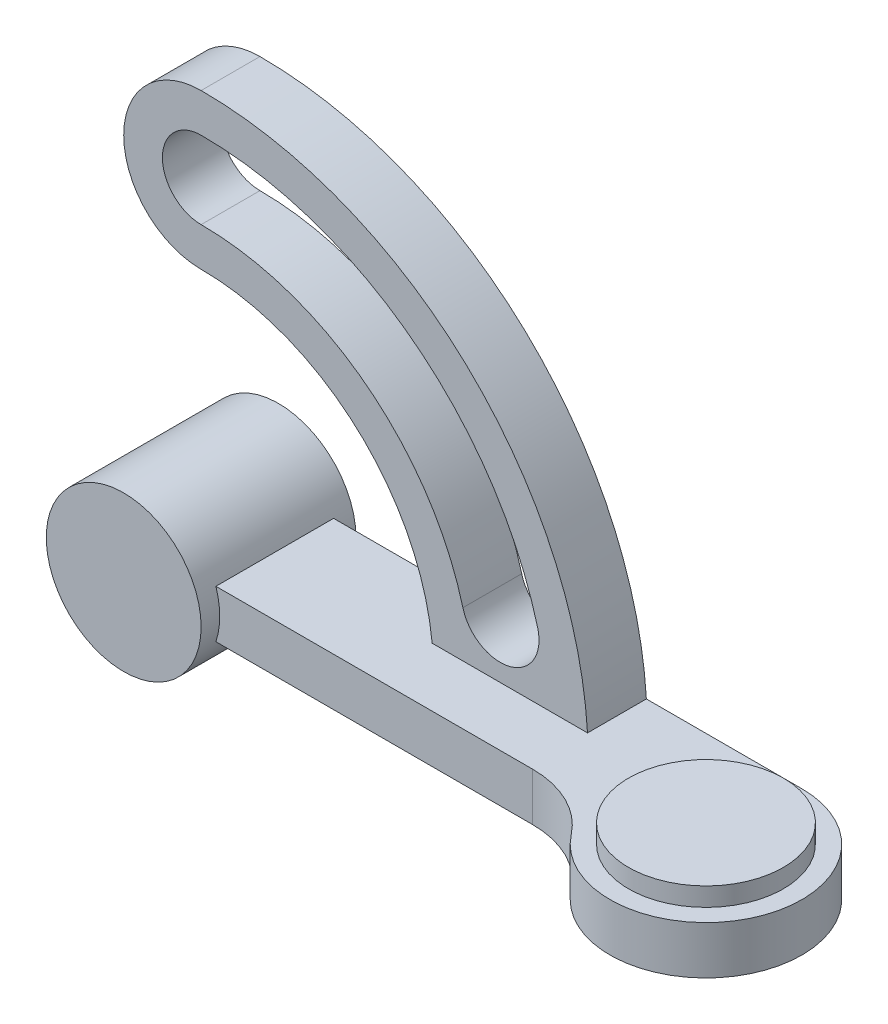
ISO-10303-21;
HEADER;
FILE_DESCRIPTION(('STEP AP214'),'2;1');
FILE_NAME('part.step','',(''),(''),'','','');
FILE_SCHEMA(('AUTOMOTIVE_DESIGN { 1 0 10303 214 1 1 1 1 }'));
ENDSEC;
DATA;
#1=APPLICATION_CONTEXT('core data for automotive mechanical design processes');
#2=APPLICATION_PROTOCOL_DEFINITION('international standard','automotive_design',2000,#1);
#3=PRODUCT_CONTEXT('',#1,'mechanical');
#4=PRODUCT('Part','Part','',(#3));
#5=PRODUCT_RELATED_PRODUCT_CATEGORY('part','',(#4));
#6=PRODUCT_DEFINITION_FORMATION('','',#4);
#7=PRODUCT_DEFINITION_CONTEXT('part definition',#1,'design');
#8=PRODUCT_DEFINITION('design','',#6,#7);
#9=PRODUCT_DEFINITION_SHAPE('','',#8);
#10=(LENGTH_UNIT() NAMED_UNIT(*) SI_UNIT(.MILLI.,.METRE.));
#11=(NAMED_UNIT(*) PLANE_ANGLE_UNIT() SI_UNIT($,.RADIAN.));
#12=(NAMED_UNIT(*) SI_UNIT($,.STERADIAN.) SOLID_ANGLE_UNIT());
#13=UNCERTAINTY_MEASURE_WITH_UNIT(LENGTH_MEASURE(1.E-05),#10,'distance_accuracy_value','');
#14=(GEOMETRIC_REPRESENTATION_CONTEXT(3) GLOBAL_UNCERTAINTY_ASSIGNED_CONTEXT((#13)) GLOBAL_UNIT_ASSIGNED_CONTEXT((#10,
#11,#12)) REPRESENTATION_CONTEXT('',''));
#15=CARTESIAN_POINT('',(0.,0.,0.));
#16=DIRECTION('',(0.,0.,1.));
#17=DIRECTION('',(1.,0.,0.));
#18=AXIS2_PLACEMENT_3D('',#15,#16,#17);
#19=CARTESIAN_POINT('',(-88.9,3.937,-18.796));
#20=DIRECTION('',(0.,0.,1.));
#21=DIRECTION('',(1.,0.,0.));
#22=AXIS2_PLACEMENT_3D('',#19,#20,#21);
#23=CYLINDRICAL_SURFACE('',#22,12.7);
#24=CARTESIAN_POINT('',(-88.9,3.937,3.55600000000001));
#25=DIRECTION('',(0.,0.,-1.));
#26=DIRECTION('',(-1.,0.,0.));
#27=AXIS2_PLACEMENT_3D('',#24,#25,#26);
#28=CIRCLE('',#27,12.7);
#29=CARTESIAN_POINT('',(-76.8256457315515,7.874,3.55600000000001));
#30=VERTEX_POINT('',#29);
#31=CARTESIAN_POINT('',(-76.8256457315515,0.,3.55600000000001));
#32=VERTEX_POINT('',#31);
#33=EDGE_CURVE('E206',#30,#32,#28,.T.);
#34=ORIENTED_EDGE('',*,*,#33,.F.);
#35=DIRECTION('',(0.,0.,1.));
#36=VECTOR('',#35,1.);
#37=CARTESIAN_POINT('',(-76.8256457315515,7.874,-18.796));
#38=LINE('',#37,#36);
#39=CARTESIAN_POINT('',(-76.8256457315515,7.874,-15.748));
#40=VERTEX_POINT('',#39);
#41=EDGE_CURVE('E212',#30,#40,#38,.F.);
#42=ORIENTED_EDGE('',*,*,#41,.T.);
#43=CARTESIAN_POINT('',(-88.9,3.937,-15.748));
#44=DIRECTION('',(0.,0.,1.));
#45=DIRECTION('',(1.,0.,0.));
#46=AXIS2_PLACEMENT_3D('',#43,#44,#45);
#47=CIRCLE('',#46,12.7);
#48=CARTESIAN_POINT('',(-76.8256457315515,0.,-15.748));
#49=VERTEX_POINT('',#48);
#50=EDGE_CURVE('E209',#49,#40,#47,.T.);
#51=ORIENTED_EDGE('',*,*,#50,.F.);
#52=DIRECTION('',(0.,0.,1.));
#53=VECTOR('',#52,1.);
#54=CARTESIAN_POINT('',(-76.8256457315515,0.,-18.796));
#55=LINE('',#54,#53);
#56=EDGE_CURVE('E11',#32,#49,#55,.F.);
#57=ORIENTED_EDGE('',*,*,#56,.F.);
#58=EDGE_LOOP('',(#34,#42,#51,#57));
#59=FACE_BOUND('',#58,.T.);
#60=CARTESIAN_POINT('',(-88.9,3.937,-18.796));
#61=DIRECTION('',(0.,0.,1.));
#62=DIRECTION('',(1.,0.,0.));
#63=AXIS2_PLACEMENT_3D('',#60,#61,#62);
#64=CIRCLE('',#63,12.7);
#65=CARTESIAN_POINT('',(-76.2,3.937,-18.796));
#66=VERTEX_POINT('',#65);
#67=EDGE_CURVE('E203',#66,#66,#64,.T.);
#68=ORIENTED_EDGE('',*,*,#67,.T.);
#69=EDGE_LOOP('',(#68));
#70=FACE_BOUND('',#69,.T.);
#71=CARTESIAN_POINT('',(-88.9,3.937,6.604));
#72=DIRECTION('',(0.,0.,1.));
#73=DIRECTION('',(1.,0.,0.));
#74=AXIS2_PLACEMENT_3D('',#71,#72,#73);
#75=CIRCLE('',#74,12.7);
#76=CARTESIAN_POINT('',(-76.2,3.937,6.604));
#77=VERTEX_POINT('',#76);
#78=EDGE_CURVE('E194',#77,#77,#75,.T.);
#79=ORIENTED_EDGE('',*,*,#78,.F.);
#80=EDGE_LOOP('',(#79));
#81=FACE_BOUND('',#80,.T.);
#82=ADVANCED_FACE('F36',(#59,#70,#81),#23,.T.);
#83=CARTESIAN_POINT('',(-88.9,3.937,-18.796));
#84=DIRECTION('',(0.,0.,1.));
#85=DIRECTION('',(1.,0.,0.));
#86=AXIS2_PLACEMENT_3D('',#83,#84,#85);
#87=PLANE('',#86);
#88=ORIENTED_EDGE('',*,*,#67,.F.);
#89=EDGE_LOOP('',(#88));
#90=FACE_BOUND('',#89,.T.);
#91=ADVANCED_FACE('F287',(#90),#87,.F.);
#92=CARTESIAN_POINT('',(-88.9,3.937,6.604));
#93=DIRECTION('',(0.,0.,1.));
#94=DIRECTION('',(1.,0.,0.));
#95=AXIS2_PLACEMENT_3D('',#92,#93,#94);
#96=PLANE('',#95);
#97=ORIENTED_EDGE('',*,*,#78,.T.);
#98=EDGE_LOOP('',(#97));
#99=FACE_BOUND('',#98,.T.);
#100=ADVANCED_FACE('F292',(#99),#96,.T.);
#101=CARTESIAN_POINT('',(0.,7.874,0.));
#102=DIRECTION('',(0.,-1.,0.));
#103=DIRECTION('',(0.,0.,-1.));
#104=AXIS2_PLACEMENT_3D('',#101,#102,#103);
#105=CYLINDRICAL_SURFACE('',#104,15.748);
#106=CARTESIAN_POINT('',(0.,0.,0.));
#107=DIRECTION('',(0.,1.,0.));
#108=DIRECTION('',(0.,0.,1.));
#109=AXIS2_PLACEMENT_3D('',#106,#107,#108);
#110=CIRCLE('',#109,15.748);
#111=CARTESIAN_POINT('',(-12.4434078933385,0.,9.652));
#112=VERTEX_POINT('',#111);
#113=CARTESIAN_POINT('',(0.,0.,-15.748));
#114=VERTEX_POINT('',#113);
#115=EDGE_CURVE('E215',#112,#114,#110,.T.);
#116=ORIENTED_EDGE('',*,*,#115,.T.);
#117=DIRECTION('',(0.,-1.,0.));
#118=VECTOR('',#117,1.);
#119=CARTESIAN_POINT('',(0.,7.874,-15.748));
#120=LINE('',#119,#118);
#121=CARTESIAN_POINT('',(0.,7.874,-15.748));
#122=VERTEX_POINT('',#121);
#123=EDGE_CURVE('E44',#122,#114,#120,.T.);
#124=ORIENTED_EDGE('',*,*,#123,.F.);
#125=CARTESIAN_POINT('',(0.,7.874,0.));
#126=DIRECTION('',(0.,1.,0.));
#127=DIRECTION('',(0.,0.,1.));
#128=AXIS2_PLACEMENT_3D('',#125,#126,#127);
#129=CIRCLE('',#128,15.748);
#130=CARTESIAN_POINT('',(-12.4434078933385,7.874,9.652));
#131=VERTEX_POINT('',#130);
#132=EDGE_CURVE('E216',#131,#122,#129,.T.);
#133=ORIENTED_EDGE('',*,*,#132,.F.);
#134=DIRECTION('',(0.,-1.,0.));
#135=VECTOR('',#134,1.);
#136=CARTESIAN_POINT('',(-12.4434078933385,7.874,9.652));
#137=LINE('',#136,#135);
#138=EDGE_CURVE('E228',#131,#112,#137,.T.);
#139=ORIENTED_EDGE('',*,*,#138,.T.);
#140=EDGE_LOOP('',(#116,#124,#133,#139));
#141=FACE_BOUND('',#140,.T.);
#142=ADVANCED_FACE('F38',(#141),#105,.T.);
#143=CARTESIAN_POINT('',(0.,7.874,-15.748));
#144=DIRECTION('',(0.,0.,1.));
#145=DIRECTION('',(1.,0.,0.));
#146=AXIS2_PLACEMENT_3D('',#143,#144,#145);
#147=PLANE('',#146);
#148=CARTESIAN_POINT('',(-88.9,54.737,-15.748));
#149=DIRECTION('',(0.,0.,1.));
#150=DIRECTION('',(1.,0.,0.));
#151=AXIS2_PLACEMENT_3D('',#148,#149,#150);
#152=CIRCLE('',#151,6.34999999999999);
#153=CARTESIAN_POINT('',(-88.9,61.087,-15.748));
#154=VERTEX_POINT('',#153);
#155=CARTESIAN_POINT('',(-88.9,48.387,-15.748));
#156=VERTEX_POINT('',#155);
#157=EDGE_CURVE('E139',#154,#156,#152,.T.);
#158=ORIENTED_EDGE('',*,*,#157,.T.);
#159=CARTESIAN_POINT('',(-88.9,3.937,-15.748));
#160=DIRECTION('',(0.,0.,-1.));
#161=DIRECTION('',(-1.,0.,0.));
#162=AXIS2_PLACEMENT_3D('',#159,#160,#161);
#163=CIRCLE('',#162,44.45);
#164=CARTESIAN_POINT('',(-45.9645970214509,15.4415065548069,-15.748));
#165=VERTEX_POINT('',#164);
#166=EDGE_CURVE('E133',#156,#165,#163,.T.);
#167=ORIENTED_EDGE('',*,*,#166,.T.);
#168=CARTESIAN_POINT('',(-39.8309680245153,17.0850074912079,-15.748));
#169=DIRECTION('',(0.,0.,1.));
#170=DIRECTION('',(1.,0.,0.));
#171=AXIS2_PLACEMENT_3D('',#168,#169,#170);
#172=CIRCLE('',#171,6.35);
#173=CARTESIAN_POINT('',(-33.6973390275797,18.7285084276089,-15.748));
#174=VERTEX_POINT('',#173);
#175=EDGE_CURVE('E142',#165,#174,#172,.T.);
#176=ORIENTED_EDGE('',*,*,#175,.T.);
#177=CARTESIAN_POINT('',(-88.9,3.937,-15.748));
#178=DIRECTION('',(0.,0.,1.));
#179=DIRECTION('',(-1.,0.,0.));
#180=AXIS2_PLACEMENT_3D('',#177,#178,#179);
#181=CIRCLE('',#180,57.15);
#182=EDGE_CURVE('E51',#174,#154,#181,.T.);
#183=ORIENTED_EDGE('',*,*,#182,.T.);
#184=EDGE_LOOP('',(#158,#167,#176,#183));
#185=FACE_BOUND('',#184,.T.);
#186=DIRECTION('',(-1.,0.,0.));
#187=VECTOR('',#186,1.);
#188=CARTESIAN_POINT('',(0.,0.,-15.748));
#189=LINE('',#188,#187);
#190=EDGE_CURVE('E231',#114,#49,#189,.T.);
#191=ORIENTED_EDGE('',*,*,#190,.T.);
#192=ORIENTED_EDGE('',*,*,#50,.T.);
#193=DIRECTION('',(-1.,0.,0.));
#194=VECTOR('',#193,1.);
#195=CARTESIAN_POINT('',(0.,7.874,-15.748));
#196=LINE('',#195,#194);
#197=CARTESIAN_POINT('',(-51.0039575812988,7.87400000000001,-15.748));
#198=VERTEX_POINT('',#197);
#199=EDGE_CURVE('E219',#198,#40,#196,.T.);
#200=ORIENTED_EDGE('',*,*,#199,.F.);
#201=CARTESIAN_POINT('',(-88.9,3.937,-15.748));
#202=DIRECTION('',(0.,0.,-1.));
#203=DIRECTION('',(-1.,0.,0.));
#204=AXIS2_PLACEMENT_3D('',#201,#202,#203);
#205=CIRCLE('',#204,38.1);
#206=CARTESIAN_POINT('',(-88.9,42.037,-15.748));
#207=VERTEX_POINT('',#206);
#208=EDGE_CURVE('E179',#207,#198,#205,.T.);
#209=ORIENTED_EDGE('',*,*,#208,.F.);
#210=CARTESIAN_POINT('',(-88.9,54.737,-15.748));
#211=DIRECTION('',(0.,0.,1.));
#212=DIRECTION('',(1.,0.,0.));
#213=AXIS2_PLACEMENT_3D('',#210,#211,#212);
#214=CIRCLE('',#213,12.7);
#215=CARTESIAN_POINT('',(-88.9,67.437,-15.748));
#216=VERTEX_POINT('',#215);
#217=EDGE_CURVE('E175',#216,#207,#214,.T.);
#218=ORIENTED_EDGE('',*,*,#217,.F.);
#219=CARTESIAN_POINT('',(-88.9,3.937,-15.748));
#220=DIRECTION('',(0.,0.,1.));
#221=DIRECTION('',(-1.,0.,0.));
#222=AXIS2_PLACEMENT_3D('',#219,#220,#221);
#223=CIRCLE('',#222,63.5);
#224=CARTESIAN_POINT('',(-25.522164513136,7.874,-15.748));
#225=VERTEX_POINT('',#224);
#226=EDGE_CURVE('E172',#225,#216,#223,.T.);
#227=ORIENTED_EDGE('',*,*,#226,.F.);
#228=EDGE_CURVE('E221',#122,#225,#196,.T.);
#229=ORIENTED_EDGE('',*,*,#228,.F.);
#230=ORIENTED_EDGE('',*,*,#123,.T.);
#231=EDGE_LOOP('',(#191,#192,#200,#209,#218,#227,#229,#230));
#232=FACE_BOUND('',#231,.T.);
#233=ADVANCED_FACE('F146',(#185,#232),#147,.F.);
#234=CARTESIAN_POINT('',(-88.9,7.874,3.55600000000001));
#235=DIRECTION('',(0.,0.,-1.));
#236=DIRECTION('',(-1.,0.,0.));
#237=AXIS2_PLACEMENT_3D('',#234,#235,#236);
#238=PLANE('',#237);
#239=DIRECTION('',(1.,0.,0.));
#240=VECTOR('',#239,1.);
#241=CARTESIAN_POINT('',(-88.9,7.874,3.55600000000001));
#242=LINE('',#241,#240);
#243=CARTESIAN_POINT('',(-24.8868157866771,7.874,3.55600000000001));
#244=VERTEX_POINT('',#243);
#245=EDGE_CURVE('E224',#30,#244,#242,.T.);
#246=ORIENTED_EDGE('',*,*,#245,.F.);
#247=ORIENTED_EDGE('',*,*,#33,.T.);
#248=DIRECTION('',(1.,0.,0.));
#249=VECTOR('',#248,1.);
#250=CARTESIAN_POINT('',(-88.9,0.,3.55600000000001));
#251=LINE('',#250,#249);
#252=CARTESIAN_POINT('',(-24.8868157866771,0.,3.55600000000001));
#253=VERTEX_POINT('',#252);
#254=EDGE_CURVE('E234',#32,#253,#251,.T.);
#255=ORIENTED_EDGE('',*,*,#254,.T.);
#256=DIRECTION('',(0.,-1.,0.));
#257=VECTOR('',#256,1.);
#258=CARTESIAN_POINT('',(-24.8868157866771,7.874,3.55600000000001));
#259=LINE('',#258,#257);
#260=EDGE_CURVE('E239',#244,#253,#259,.T.);
#261=ORIENTED_EDGE('',*,*,#260,.F.);
#262=EDGE_LOOP('',(#246,#247,#255,#261));
#263=FACE_BOUND('',#262,.T.);
#264=ADVANCED_FACE('F257',(#263),#238,.F.);
#265=CARTESIAN_POINT('',(-24.8868157866771,7.874,19.304));
#266=DIRECTION('',(0.,-1.,0.));
#267=DIRECTION('',(0.,0.,-1.));
#268=AXIS2_PLACEMENT_3D('',#265,#266,#267);
#269=CYLINDRICAL_SURFACE('',#268,15.748);
#270=CARTESIAN_POINT('',(-24.8868157866771,0.,19.304));
#271=DIRECTION('',(0.,-1.,0.));
#272=DIRECTION('',(0.,0.,1.));
#273=AXIS2_PLACEMENT_3D('',#270,#271,#272);
#274=CIRCLE('',#273,15.748);
#275=EDGE_CURVE('E220',#253,#112,#274,.T.);
#276=ORIENTED_EDGE('',*,*,#275,.T.);
#277=ORIENTED_EDGE('',*,*,#138,.F.);
#278=CARTESIAN_POINT('',(-24.8868157866771,7.874,19.304));
#279=DIRECTION('',(0.,-1.,0.));
#280=DIRECTION('',(0.,0.,1.));
#281=AXIS2_PLACEMENT_3D('',#278,#279,#280);
#282=CIRCLE('',#281,15.748);
#283=EDGE_CURVE('E226',#244,#131,#282,.T.);
#284=ORIENTED_EDGE('',*,*,#283,.F.);
#285=ORIENTED_EDGE('',*,*,#260,.T.);
#286=EDGE_LOOP('',(#276,#277,#284,#285));
#287=FACE_BOUND('',#286,.T.);
#288=ADVANCED_FACE('F299',(#287),#269,.F.);
#289=CARTESIAN_POINT('',(0.,7.874,0.));
#290=DIRECTION('',(0.,1.,0.));
#291=DIRECTION('',(0.,0.,1.));
#292=AXIS2_PLACEMENT_3D('',#289,#290,#291);
#293=PLANE('',#292);
#294=CARTESIAN_POINT('',(0.,7.874,0.));
#295=DIRECTION('',(0.,1.,0.));
#296=DIRECTION('',(0.,0.,1.));
#297=AXIS2_PLACEMENT_3D('',#294,#295,#296);
#298=CIRCLE('',#297,12.7);
#299=CARTESIAN_POINT('',(0.,7.874,-12.7));
#300=VERTEX_POINT('',#299);
#301=EDGE_CURVE('E155',#300,#300,#298,.T.);
#302=ORIENTED_EDGE('',*,*,#301,.F.);
#303=EDGE_LOOP('',(#302));
#304=FACE_BOUND('',#303,.T.);
#305=DIRECTION('',(0.,0.,1.));
#306=VECTOR('',#305,1.);
#307=CARTESIAN_POINT('',(-25.522164513136,7.874,-15.748));
#308=LINE('',#307,#306);
#309=CARTESIAN_POINT('',(-25.522164513136,7.874,-6.096));
#310=VERTEX_POINT('',#309);
#311=EDGE_CURVE('E191',#225,#310,#308,.T.);
#312=ORIENTED_EDGE('',*,*,#311,.T.);
#313=DIRECTION('',(1.,0.,0.));
#314=VECTOR('',#313,1.);
#315=CARTESIAN_POINT('',(-51.0039575812988,7.874,-6.096));
#316=LINE('',#315,#314);
#317=CARTESIAN_POINT('',(-51.0039575812988,7.874,-6.096));
#318=VERTEX_POINT('',#317);
#319=EDGE_CURVE('E176',#318,#310,#316,.T.);
#320=ORIENTED_EDGE('',*,*,#319,.F.);
#321=DIRECTION('',(0.,0.,1.));
#322=VECTOR('',#321,1.);
#323=CARTESIAN_POINT('',(-51.0039575812988,7.87400000000001,-15.748));
#324=LINE('',#323,#322);
#325=EDGE_CURVE('E195',#198,#318,#324,.T.);
#326=ORIENTED_EDGE('',*,*,#325,.F.);
#327=ORIENTED_EDGE('',*,*,#199,.T.);
#328=ORIENTED_EDGE('',*,*,#41,.F.);
#329=ORIENTED_EDGE('',*,*,#245,.T.);
#330=ORIENTED_EDGE('',*,*,#283,.T.);
#331=ORIENTED_EDGE('',*,*,#132,.T.);
#332=ORIENTED_EDGE('',*,*,#228,.T.);
#333=EDGE_LOOP('',(#312,#320,#326,#327,#328,#329,#330,#331,#332));
#334=FACE_BOUND('',#333,.T.);
#335=ADVANCED_FACE('F261',(#304,#334),#293,.T.);
#336=CARTESIAN_POINT('',(0.,0.,0.));
#337=DIRECTION('',(0.,1.,0.));
#338=DIRECTION('',(0.,0.,1.));
#339=AXIS2_PLACEMENT_3D('',#336,#337,#338);
#340=PLANE('',#339);
#341=ORIENTED_EDGE('',*,*,#254,.F.);
#342=ORIENTED_EDGE('',*,*,#56,.T.);
#343=ORIENTED_EDGE('',*,*,#190,.F.);
#344=ORIENTED_EDGE('',*,*,#115,.F.);
#345=ORIENTED_EDGE('',*,*,#275,.F.);
#346=EDGE_LOOP('',(#341,#342,#343,#344,#345));
#347=FACE_BOUND('',#346,.T.);
#348=ADVANCED_FACE('F251',(#347),#340,.F.);
#349=CARTESIAN_POINT('',(-88.9,3.937,-15.748));
#350=DIRECTION('',(0.,0.,1.));
#351=DIRECTION('',(1.,0.,0.));
#352=AXIS2_PLACEMENT_3D('',#349,#350,#351);
#353=CYLINDRICAL_SURFACE('',#352,63.5);
#354=CARTESIAN_POINT('',(-88.9,3.937,-6.096));
#355=DIRECTION('',(0.,0.,1.));
#356=DIRECTION('',(-1.,0.,0.));
#357=AXIS2_PLACEMENT_3D('',#354,#355,#356);
#358=CIRCLE('',#357,63.5);
#359=CARTESIAN_POINT('',(-88.9,67.437,-6.096));
#360=VERTEX_POINT('',#359);
#361=EDGE_CURVE('E168',#310,#360,#358,.T.);
#362=ORIENTED_EDGE('',*,*,#361,.F.);
#363=ORIENTED_EDGE('',*,*,#311,.F.);
#364=ORIENTED_EDGE('',*,*,#226,.T.);
#365=DIRECTION('',(0.,0.,1.));
#366=VECTOR('',#365,1.);
#367=CARTESIAN_POINT('',(-88.9,67.437,-15.748));
#368=LINE('',#367,#366);
#369=EDGE_CURVE('E181',#216,#360,#368,.T.);
#370=ORIENTED_EDGE('',*,*,#369,.T.);
#371=EDGE_LOOP('',(#362,#363,#364,#370));
#372=FACE_BOUND('',#371,.T.);
#373=ADVANCED_FACE('F272',(#372),#353,.T.);
#374=CARTESIAN_POINT('',(-88.9,3.937,-15.748));
#375=DIRECTION('',(0.,0.,1.));
#376=DIRECTION('',(1.,0.,0.));
#377=AXIS2_PLACEMENT_3D('',#374,#375,#376);
#378=CYLINDRICAL_SURFACE('',#377,38.1);
#379=CARTESIAN_POINT('',(-88.9,3.937,-6.096));
#380=DIRECTION('',(0.,0.,-1.));
#381=DIRECTION('',(-1.,0.,0.));
#382=AXIS2_PLACEMENT_3D('',#379,#380,#381);
#383=CIRCLE('',#382,38.1);
#384=CARTESIAN_POINT('',(-88.9,42.037,-6.096));
#385=VERTEX_POINT('',#384);
#386=EDGE_CURVE('E187',#385,#318,#383,.T.);
#387=ORIENTED_EDGE('',*,*,#386,.F.);
#388=DIRECTION('',(0.,0.,1.));
#389=VECTOR('',#388,1.);
#390=CARTESIAN_POINT('',(-88.9,42.037,-15.748));
#391=LINE('',#390,#389);
#392=EDGE_CURVE('E198',#207,#385,#391,.T.);
#393=ORIENTED_EDGE('',*,*,#392,.F.);
#394=ORIENTED_EDGE('',*,*,#208,.T.);
#395=ORIENTED_EDGE('',*,*,#325,.T.);
#396=EDGE_LOOP('',(#387,#393,#394,#395));
#397=FACE_BOUND('',#396,.T.);
#398=ADVANCED_FACE('F276',(#397),#378,.F.);
#399=CARTESIAN_POINT('',(-88.9,54.737,-15.748));
#400=DIRECTION('',(0.,0.,1.));
#401=DIRECTION('',(1.,0.,0.));
#402=AXIS2_PLACEMENT_3D('',#399,#400,#401);
#403=CYLINDRICAL_SURFACE('',#402,12.7);
#404=CARTESIAN_POINT('',(-88.9,54.737,-6.096));
#405=DIRECTION('',(0.,0.,1.));
#406=DIRECTION('',(1.,0.,0.));
#407=AXIS2_PLACEMENT_3D('',#404,#405,#406);
#408=CIRCLE('',#407,12.7);
#409=EDGE_CURVE('E184',#360,#385,#408,.T.);
#410=ORIENTED_EDGE('',*,*,#409,.F.);
#411=ORIENTED_EDGE('',*,*,#369,.F.);
#412=ORIENTED_EDGE('',*,*,#217,.T.);
#413=ORIENTED_EDGE('',*,*,#392,.T.);
#414=EDGE_LOOP('',(#410,#411,#412,#413));
#415=FACE_BOUND('',#414,.T.);
#416=ADVANCED_FACE('F269',(#415),#403,.T.);
#417=CARTESIAN_POINT('',(-88.9,3.937,-6.096));
#418=DIRECTION('',(0.,0.,-1.));
#419=DIRECTION('',(-1.,0.,0.));
#420=AXIS2_PLACEMENT_3D('',#417,#418,#419);
#421=PLANE('',#420);
#422=CARTESIAN_POINT('',(-39.8309680245153,17.0850074912079,-6.096));
#423=DIRECTION('',(0.,0.,1.));
#424=DIRECTION('',(1.,0.,0.));
#425=AXIS2_PLACEMENT_3D('',#422,#423,#424);
#426=CIRCLE('',#425,6.35);
#427=CARTESIAN_POINT('',(-45.9645970214509,15.4415065548069,-6.096));
#428=VERTEX_POINT('',#427);
#429=CARTESIAN_POINT('',(-33.6973390275797,18.7285084276089,-6.096));
#430=VERTEX_POINT('',#429);
#431=EDGE_CURVE('E161',#428,#430,#426,.T.);
#432=ORIENTED_EDGE('',*,*,#431,.F.);
#433=CARTESIAN_POINT('',(-88.9,3.937,-6.096));
#434=DIRECTION('',(0.,0.,-1.));
#435=DIRECTION('',(-1.,0.,0.));
#436=AXIS2_PLACEMENT_3D('',#433,#434,#435);
#437=CIRCLE('',#436,44.45);
#438=CARTESIAN_POINT('',(-88.9,48.387,-6.096));
#439=VERTEX_POINT('',#438);
#440=EDGE_CURVE('E59',#439,#428,#437,.T.);
#441=ORIENTED_EDGE('',*,*,#440,.F.);
#442=CARTESIAN_POINT('',(-88.9,54.737,-6.096));
#443=DIRECTION('',(0.,0.,1.));
#444=DIRECTION('',(1.,0.,0.));
#445=AXIS2_PLACEMENT_3D('',#442,#443,#444);
#446=CIRCLE('',#445,6.34999999999999);
#447=CARTESIAN_POINT('',(-88.9,61.087,-6.096));
#448=VERTEX_POINT('',#447);
#449=EDGE_CURVE('E149',#448,#439,#446,.T.);
#450=ORIENTED_EDGE('',*,*,#449,.F.);
#451=CARTESIAN_POINT('',(-88.9,3.937,-6.096));
#452=DIRECTION('',(0.,0.,1.));
#453=DIRECTION('',(-1.,0.,0.));
#454=AXIS2_PLACEMENT_3D('',#451,#452,#453);
#455=CIRCLE('',#454,57.15);
#456=EDGE_CURVE('E152',#430,#448,#455,.T.);
#457=ORIENTED_EDGE('',*,*,#456,.F.);
#458=EDGE_LOOP('',(#432,#441,#450,#457));
#459=FACE_BOUND('',#458,.T.);
#460=ORIENTED_EDGE('',*,*,#361,.T.);
#461=ORIENTED_EDGE('',*,*,#409,.T.);
#462=ORIENTED_EDGE('',*,*,#386,.T.);
#463=ORIENTED_EDGE('',*,*,#319,.T.);
#464=EDGE_LOOP('',(#460,#461,#462,#463));
#465=FACE_BOUND('',#464,.T.);
#466=ADVANCED_FACE('F275',(#459,#465),#421,.F.);
#467=CARTESIAN_POINT('',(-88.9,3.937,-15.748));
#468=DIRECTION('',(0.,0.,1.));
#469=DIRECTION('',(1.,0.,0.));
#470=AXIS2_PLACEMENT_3D('',#467,#468,#469);
#471=CYLINDRICAL_SURFACE('',#470,44.45);
#472=ORIENTED_EDGE('',*,*,#440,.T.);
#473=DIRECTION('',(0.,0.,1.));
#474=VECTOR('',#473,1.);
#475=CARTESIAN_POINT('',(-45.9645970214509,15.4415065548069,-15.748));
#476=LINE('',#475,#474);
#477=EDGE_CURVE('E129',#165,#428,#476,.T.);
#478=ORIENTED_EDGE('',*,*,#477,.F.);
#479=ORIENTED_EDGE('',*,*,#166,.F.);
#480=DIRECTION('',(0.,0.,1.));
#481=VECTOR('',#480,1.);
#482=CARTESIAN_POINT('',(-88.9,48.387,-15.748));
#483=LINE('',#482,#481);
#484=EDGE_CURVE('E166',#156,#439,#483,.T.);
#485=ORIENTED_EDGE('',*,*,#484,.T.);
#486=EDGE_LOOP('',(#472,#478,#479,#485));
#487=FACE_BOUND('',#486,.T.);
#488=ADVANCED_FACE('F131',(#487),#471,.T.);
#489=CARTESIAN_POINT('',(-88.9,54.737,-15.748));
#490=DIRECTION('',(0.,0.,1.));
#491=DIRECTION('',(1.,0.,0.));
#492=AXIS2_PLACEMENT_3D('',#489,#490,#491);
#493=CYLINDRICAL_SURFACE('',#492,6.34999999999999);
#494=ORIENTED_EDGE('',*,*,#449,.T.);
#495=ORIENTED_EDGE('',*,*,#484,.F.);
#496=ORIENTED_EDGE('',*,*,#157,.F.);
#497=DIRECTION('',(0.,0.,1.));
#498=VECTOR('',#497,1.);
#499=CARTESIAN_POINT('',(-88.9,61.087,-15.748));
#500=LINE('',#499,#498);
#501=EDGE_CURVE('E169',#154,#448,#500,.T.);
#502=ORIENTED_EDGE('',*,*,#501,.T.);
#503=EDGE_LOOP('',(#494,#495,#496,#502));
#504=FACE_BOUND('',#503,.T.);
#505=ADVANCED_FACE('F390',(#504),#493,.F.);
#506=CARTESIAN_POINT('',(-88.9,3.937,-15.748));
#507=DIRECTION('',(0.,0.,1.));
#508=DIRECTION('',(1.,0.,0.));
#509=AXIS2_PLACEMENT_3D('',#506,#507,#508);
#510=CYLINDRICAL_SURFACE('',#509,57.15);
#511=ORIENTED_EDGE('',*,*,#456,.T.);
#512=ORIENTED_EDGE('',*,*,#501,.F.);
#513=ORIENTED_EDGE('',*,*,#182,.F.);
#514=DIRECTION('',(0.,0.,1.));
#515=VECTOR('',#514,1.);
#516=CARTESIAN_POINT('',(-33.6973390275797,18.7285084276089,-15.748));
#517=LINE('',#516,#515);
#518=EDGE_CURVE('E138',#174,#430,#517,.T.);
#519=ORIENTED_EDGE('',*,*,#518,.T.);
#520=EDGE_LOOP('',(#511,#512,#513,#519));
#521=FACE_BOUND('',#520,.T.);
#522=ADVANCED_FACE('F399',(#521),#510,.F.);
#523=CARTESIAN_POINT('',(-39.8309680245153,17.0850074912079,-15.748));
#524=DIRECTION('',(0.,0.,1.));
#525=DIRECTION('',(1.,0.,0.));
#526=AXIS2_PLACEMENT_3D('',#523,#524,#525);
#527=CYLINDRICAL_SURFACE('',#526,6.35);
#528=ORIENTED_EDGE('',*,*,#431,.T.);
#529=ORIENTED_EDGE('',*,*,#518,.F.);
#530=ORIENTED_EDGE('',*,*,#175,.F.);
#531=ORIENTED_EDGE('',*,*,#477,.T.);
#532=EDGE_LOOP('',(#528,#529,#530,#531));
#533=FACE_BOUND('',#532,.T.);
#534=ADVANCED_FACE('F143',(#533),#527,.F.);
#535=CARTESIAN_POINT('',(0.,10.922,0.));
#536=DIRECTION('',(0.,-1.,0.));
#537=DIRECTION('',(0.,0.,-1.));
#538=AXIS2_PLACEMENT_3D('',#535,#536,#537);
#539=CYLINDRICAL_SURFACE('',#538,12.7);
#540=CARTESIAN_POINT('',(0.,10.922,0.));
#541=DIRECTION('',(0.,1.,0.));
#542=DIRECTION('',(0.,0.,1.));
#543=AXIS2_PLACEMENT_3D('',#540,#541,#542);
#544=CIRCLE('',#543,12.7);
#545=CARTESIAN_POINT('',(0.,10.922,-12.7));
#546=VERTEX_POINT('',#545);
#547=EDGE_CURVE('E162',#546,#546,#544,.T.);
#548=CARTESIAN_POINT('',(0.,10.922,-12.7));
#549=CARTESIAN_POINT('',(0.,10.89025,-12.7));
#550=CARTESIAN_POINT('',(0.,10.8585,-12.7));
#551=CARTESIAN_POINT('',(0.,10.795,-12.7));
#552=CARTESIAN_POINT('',(0.,10.76325,-12.7));
#553=CARTESIAN_POINT('',(0.,10.69975,-12.7));
#554=CARTESIAN_POINT('',(0.,10.668,-12.7));
#555=CARTESIAN_POINT('',(0.,10.6045,-12.7));
#556=CARTESIAN_POINT('',(0.,10.57275,-12.7));
#557=CARTESIAN_POINT('',(0.,10.50925,-12.7));
#558=CARTESIAN_POINT('',(0.,10.4775,-12.7));
#559=CARTESIAN_POINT('',(0.,10.414,-12.7));
#560=CARTESIAN_POINT('',(0.,10.38225,-12.7));
#561=CARTESIAN_POINT('',(0.,10.31875,-12.7));
#562=CARTESIAN_POINT('',(0.,10.287,-12.7));
#563=CARTESIAN_POINT('',(0.,10.2235,-12.7));
#564=CARTESIAN_POINT('',(0.,10.19175,-12.7));
#565=CARTESIAN_POINT('',(0.,10.12825,-12.7));
#566=CARTESIAN_POINT('',(0.,10.0965,-12.7));
#567=CARTESIAN_POINT('',(0.,10.033,-12.7));
#568=CARTESIAN_POINT('',(0.,10.00125,-12.7));
#569=CARTESIAN_POINT('',(0.,9.93775,-12.7));
#570=CARTESIAN_POINT('',(0.,9.906,-12.7));
#571=CARTESIAN_POINT('',(0.,9.8425,-12.7));
#572=CARTESIAN_POINT('',(0.,9.81075,-12.7));
#573=CARTESIAN_POINT('',(0.,9.74725,-12.7));
#574=CARTESIAN_POINT('',(0.,9.7155,-12.7));
#575=CARTESIAN_POINT('',(0.,9.652,-12.7));
#576=CARTESIAN_POINT('',(0.,9.62025,-12.7));
#577=CARTESIAN_POINT('',(0.,9.55675,-12.7));
#578=CARTESIAN_POINT('',(0.,9.525,-12.7));
#579=CARTESIAN_POINT('',(0.,9.4615,-12.7));
#580=CARTESIAN_POINT('',(0.,9.42975,-12.7));
#581=CARTESIAN_POINT('',(0.,9.36625,-12.7));
#582=CARTESIAN_POINT('',(0.,9.3345,-12.7));
#583=CARTESIAN_POINT('',(0.,9.271,-12.7));
#584=CARTESIAN_POINT('',(0.,9.23925,-12.7));
#585=CARTESIAN_POINT('',(0.,9.17575,-12.7));
#586=CARTESIAN_POINT('',(0.,9.144,-12.7));
#587=CARTESIAN_POINT('',(0.,9.0805,-12.7));
#588=CARTESIAN_POINT('',(0.,9.04875,-12.7));
#589=CARTESIAN_POINT('',(0.,8.98525,-12.7));
#590=CARTESIAN_POINT('',(0.,8.9535,-12.7));
#591=CARTESIAN_POINT('',(0.,8.89,-12.7));
#592=CARTESIAN_POINT('',(0.,8.85825,-12.7));
#593=CARTESIAN_POINT('',(0.,8.79475,-12.7));
#594=CARTESIAN_POINT('',(0.,8.763,-12.7));
#595=CARTESIAN_POINT('',(0.,8.6995,-12.7));
#596=CARTESIAN_POINT('',(0.,8.66775,-12.7));
#597=CARTESIAN_POINT('',(0.,8.60425,-12.7));
#598=CARTESIAN_POINT('',(0.,8.5725,-12.7));
#599=CARTESIAN_POINT('',(0.,8.509,-12.7));
#600=CARTESIAN_POINT('',(0.,8.47725,-12.7));
#601=CARTESIAN_POINT('',(0.,8.41375,-12.7));
#602=CARTESIAN_POINT('',(0.,8.382,-12.7));
#603=CARTESIAN_POINT('',(0.,8.3185,-12.7));
#604=CARTESIAN_POINT('',(0.,8.28675,-12.7));
#605=CARTESIAN_POINT('',(0.,8.22325,-12.7));
#606=CARTESIAN_POINT('',(0.,8.1915,-12.7));
#607=CARTESIAN_POINT('',(0.,8.128,-12.7));
#608=CARTESIAN_POINT('',(0.,8.09625,-12.7));
#609=CARTESIAN_POINT('',(0.,8.03275,-12.7));
#610=CARTESIAN_POINT('',(0.,8.001,-12.7));
#611=CARTESIAN_POINT('',(0.,7.9375,-12.7));
#612=CARTESIAN_POINT('',(0.,7.90575,-12.7));
#613=CARTESIAN_POINT('',(0.,7.874,-12.7));
#614=B_SPLINE_CURVE_WITH_KNOTS('',3,(#548,#549,#550,#551,#552,#553,#554,#555,#556,#557,#558,
#559,#560,#561,#562,#563,#564,#565,#566,#567,#568,#569,#570,#571,#572,#573,#574,#575,#576,#577,
#578,#579,#580,#581,#582,#583,#584,#585,#586,#587,#588,#589,#590,#591,#592,#593,#594,#595,#596,
#597,#598,#599,#600,#601,#602,#603,#604,#605,#606,#607,#608,#609,#610,#611,#612,#613),
.UNSPECIFIED.,.F.,.F.,(4,2,2,2,2,2,2,2,2,2,2,2,2,2,2,2,2,2,2,2,2,2,2,2,2,2,2,2,2,2,2,2,4),(0.,
0.0952499999999998,0.1905,0.28575,0.380999999999999,0.476249999999999,0.571499999999999,
0.666749999999999,0.761999999999999,0.857249999999999,0.9525,1.04775,1.143,1.23825,1.3335,
1.42875,1.524,1.61925,1.7145,1.80975,1.905,2.00025,2.0955,2.19075,2.286,2.38125,2.4765,2.57175,
2.667,2.76225,2.8575,2.95275,3.048),.UNSPECIFIED.);
#615=EDGE_CURVE('BSEAM417',#546,#300,#614,.T.);
#616=ORIENTED_EDGE('',*,*,#547,.F.);
#617=ORIENTED_EDGE('',*,*,#301,.T.);
#618=ORIENTED_EDGE('',*,*,#615,.T.);
#619=ORIENTED_EDGE('',*,*,#615,.F.);
#620=EDGE_LOOP('',(#616,#618,#617,#619));
#621=FACE_BOUND('',#620,.T.);
#622=ADVANCED_FACE('F417',(#621),#539,.T.);
#623=CARTESIAN_POINT('',(0.,10.922,0.));
#624=DIRECTION('',(0.,1.,0.));
#625=DIRECTION('',(0.,0.,1.));
#626=AXIS2_PLACEMENT_3D('',#623,#624,#625);
#627=PLANE('',#626);
#628=ORIENTED_EDGE('',*,*,#547,.T.);
#629=EDGE_LOOP('',(#628));
#630=FACE_BOUND('',#629,.T.);
#631=ADVANCED_FACE('F431',(#630),#627,.T.);
#632=CLOSED_SHELL('',(#82,#91,#100,#142,#233,#264,#288,#335,#348,#373,#398,#416,#466,#488,#505,
#522,#534,#622,#631));
#633=MANIFOLD_SOLID_BREP('B2',#632);
#634=ADVANCED_BREP_SHAPE_REPRESENTATION('',(#18,#633),#14);
#635=SHAPE_DEFINITION_REPRESENTATION(#9,#634);
ENDSEC;
END-ISO-10303-21;
